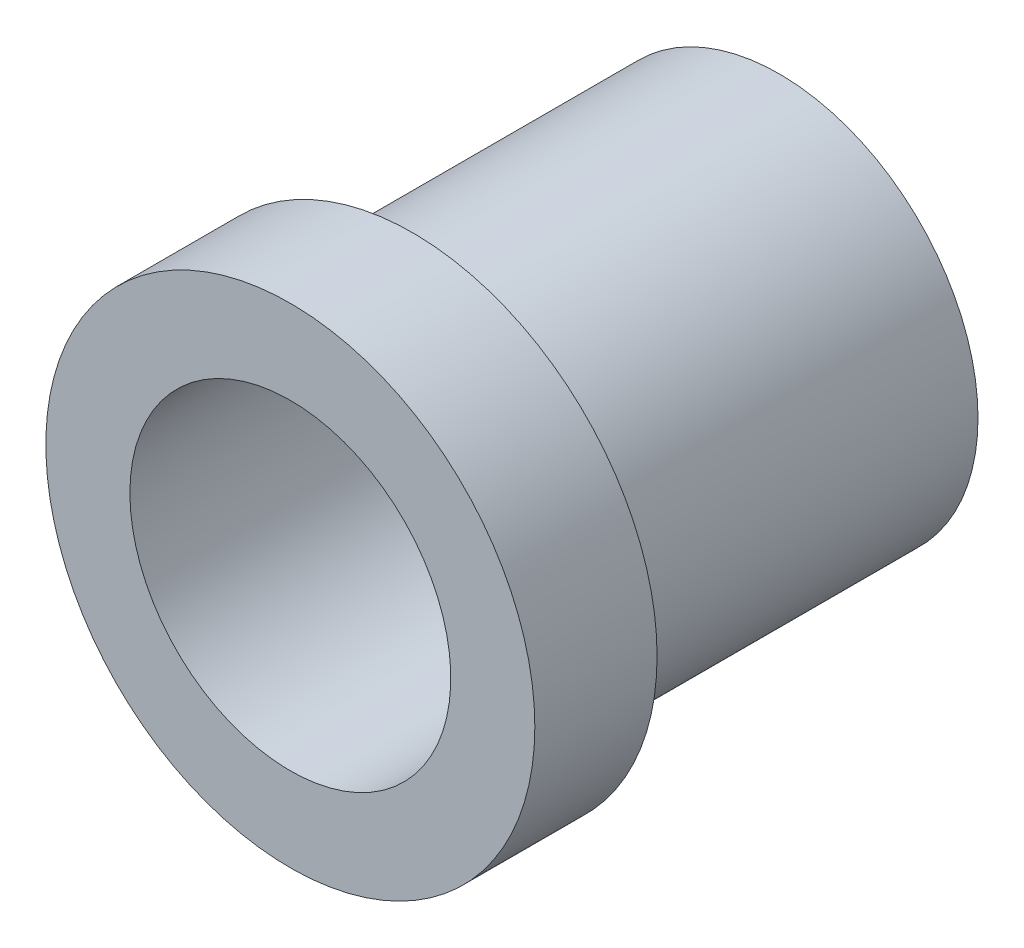
ISO-10303-21;
HEADER;
FILE_DESCRIPTION(('STEP AP214'),'2;1');
FILE_NAME('part.step','',(''),(''),'','','');
FILE_SCHEMA(('AUTOMOTIVE_DESIGN { 1 0 10303 214 1 1 1 1 }'));
ENDSEC;
DATA;
#1=APPLICATION_CONTEXT('core data for automotive mechanical design processes');
#2=APPLICATION_PROTOCOL_DEFINITION('international standard','automotive_design',2000,#1);
#3=PRODUCT_CONTEXT('',#1,'mechanical');
#4=PRODUCT('Part','Part','',(#3));
#5=PRODUCT_RELATED_PRODUCT_CATEGORY('part','',(#4));
#6=PRODUCT_DEFINITION_FORMATION('','',#4);
#7=PRODUCT_DEFINITION_CONTEXT('part definition',#1,'design');
#8=PRODUCT_DEFINITION('design','',#6,#7);
#9=PRODUCT_DEFINITION_SHAPE('','',#8);
#10=(LENGTH_UNIT() NAMED_UNIT(*) SI_UNIT(.MILLI.,.METRE.));
#11=(NAMED_UNIT(*) PLANE_ANGLE_UNIT() SI_UNIT($,.RADIAN.));
#12=(NAMED_UNIT(*) SI_UNIT($,.STERADIAN.) SOLID_ANGLE_UNIT());
#13=UNCERTAINTY_MEASURE_WITH_UNIT(LENGTH_MEASURE(1.E-05),#10,'distance_accuracy_value','');
#14=(GEOMETRIC_REPRESENTATION_CONTEXT(3) GLOBAL_UNCERTAINTY_ASSIGNED_CONTEXT((#13)) GLOBAL_UNIT_ASSIGNED_CONTEXT((#10,
#11,#12)) REPRESENTATION_CONTEXT('',''));
#15=CARTESIAN_POINT('',(0.,0.,0.));
#16=DIRECTION('',(0.,0.,1.));
#17=DIRECTION('',(1.,0.,0.));
#18=AXIS2_PLACEMENT_3D('',#15,#16,#17);
#19=CARTESIAN_POINT('',(0.,0.,12.));
#20=DIRECTION('',(0.,0.,-1.));
#21=DIRECTION('',(-1.,0.,0.));
#22=AXIS2_PLACEMENT_3D('',#19,#20,#21);
#23=CYLINDRICAL_SURFACE('',#22,6.5);
#24=CARTESIAN_POINT('',(0.,0.,12.));
#25=DIRECTION('',(0.,0.,1.));
#26=DIRECTION('',(1.,0.,0.));
#27=AXIS2_PLACEMENT_3D('',#24,#25,#26);
#28=CIRCLE('',#27,6.5);
#29=CARTESIAN_POINT('',(6.5,0.,12.));
#30=VERTEX_POINT('',#29);
#31=EDGE_CURVE('E10',#30,#30,#28,.T.);
#32=ORIENTED_EDGE('',*,*,#31,.F.);
#33=EDGE_LOOP('',(#32));
#34=FACE_BOUND('',#33,.T.);
#35=CARTESIAN_POINT('',(0.,0.,0.));
#36=DIRECTION('',(0.,0.,1.));
#37=DIRECTION('',(1.,0.,0.));
#38=AXIS2_PLACEMENT_3D('',#35,#36,#37);
#39=CIRCLE('',#38,6.5);
#40=CARTESIAN_POINT('',(6.5,0.,0.));
#41=VERTEX_POINT('',#40);
#42=EDGE_CURVE('E40',#41,#41,#39,.T.);
#43=ORIENTED_EDGE('',*,*,#42,.T.);
#44=EDGE_LOOP('',(#43));
#45=FACE_BOUND('',#44,.T.);
#46=ADVANCED_FACE('F37',(#34,#45),#23,.T.);
#47=CARTESIAN_POINT('',(0.,0.,0.));
#48=DIRECTION('',(0.,0.,1.));
#49=DIRECTION('',(1.,0.,0.));
#50=AXIS2_PLACEMENT_3D('',#47,#48,#49);
#51=PLANE('',#50);
#52=CARTESIAN_POINT('',(0.,0.,0.));
#53=DIRECTION('',(0.,0.,1.));
#54=DIRECTION('',(1.,0.,0.));
#55=AXIS2_PLACEMENT_3D('',#52,#53,#54);
#56=CIRCLE('',#55,5.25);
#57=CARTESIAN_POINT('',(5.25,0.,0.));
#58=VERTEX_POINT('',#57);
#59=EDGE_CURVE('E49',#58,#58,#56,.T.);
#60=ORIENTED_EDGE('',*,*,#59,.T.);
#61=EDGE_LOOP('',(#60));
#62=FACE_BOUND('',#61,.T.);
#63=ORIENTED_EDGE('',*,*,#42,.F.);
#64=EDGE_LOOP('',(#63));
#65=FACE_BOUND('',#64,.T.);
#66=ADVANCED_FACE('F73',(#62,#65),#51,.F.);
#67=CARTESIAN_POINT('',(0.,0.,14.));
#68=DIRECTION('',(0.,0.,-1.));
#69=DIRECTION('',(-1.,0.,0.));
#70=AXIS2_PLACEMENT_3D('',#67,#68,#69);
#71=CYLINDRICAL_SURFACE('',#70,5.25);
#72=ORIENTED_EDGE('',*,*,#59,.F.);
#73=EDGE_LOOP('',(#72));
#74=FACE_BOUND('',#73,.T.);
#75=CARTESIAN_POINT('',(0.,0.,16.));
#76=DIRECTION('',(0.,0.,-1.));
#77=DIRECTION('',(-1.,0.,0.));
#78=AXIS2_PLACEMENT_3D('',#75,#76,#77);
#79=CIRCLE('',#78,5.25);
#80=CARTESIAN_POINT('',(-5.25,0.,16.));
#81=VERTEX_POINT('',#80);
#82=EDGE_CURVE('E59',#81,#81,#79,.T.);
#83=ORIENTED_EDGE('',*,*,#82,.F.);
#84=EDGE_LOOP('',(#83));
#85=FACE_BOUND('',#84,.T.);
#86=ADVANCED_FACE('F70',(#74,#85),#71,.F.);
#87=CARTESIAN_POINT('',(0.,0.,12.));
#88=DIRECTION('',(0.,0.,1.));
#89=DIRECTION('',(1.,0.,0.));
#90=AXIS2_PLACEMENT_3D('',#87,#88,#89);
#91=PLANE('',#90);
#92=ORIENTED_EDGE('',*,*,#31,.T.);
#93=EDGE_LOOP('',(#92));
#94=FACE_BOUND('',#93,.T.);
#95=CARTESIAN_POINT('',(0.,0.,12.));
#96=DIRECTION('',(0.,0.,1.));
#97=DIRECTION('',(1.,0.,0.));
#98=AXIS2_PLACEMENT_3D('',#95,#96,#97);
#99=CIRCLE('',#98,8.);
#100=CARTESIAN_POINT('',(8.,0.,12.));
#101=VERTEX_POINT('',#100);
#102=EDGE_CURVE('E55',#101,#101,#99,.T.);
#103=ORIENTED_EDGE('',*,*,#102,.F.);
#104=EDGE_LOOP('',(#103));
#105=FACE_BOUND('',#104,.T.);
#106=ADVANCED_FACE('F72',(#94,#105),#91,.F.);
#107=CARTESIAN_POINT('',(0.,0.,16.));
#108=DIRECTION('',(0.,0.,1.));
#109=DIRECTION('',(1.,0.,0.));
#110=AXIS2_PLACEMENT_3D('',#107,#108,#109);
#111=PLANE('',#110);
#112=ORIENTED_EDGE('',*,*,#82,.T.);
#113=EDGE_LOOP('',(#112));
#114=FACE_BOUND('',#113,.T.);
#115=CARTESIAN_POINT('',(0.,0.,16.));
#116=DIRECTION('',(0.,0.,1.));
#117=DIRECTION('',(1.,0.,0.));
#118=AXIS2_PLACEMENT_3D('',#115,#116,#117);
#119=CIRCLE('',#118,8.);
#120=CARTESIAN_POINT('',(8.,0.,16.));
#121=VERTEX_POINT('',#120);
#122=EDGE_CURVE('E54',#121,#121,#119,.T.);
#123=ORIENTED_EDGE('',*,*,#122,.T.);
#124=EDGE_LOOP('',(#123));
#125=FACE_BOUND('',#124,.T.);
#126=ADVANCED_FACE('F67',(#114,#125),#111,.T.);
#127=CARTESIAN_POINT('',(0.,0.,16.));
#128=DIRECTION('',(0.,0.,-1.));
#129=DIRECTION('',(-1.,0.,0.));
#130=AXIS2_PLACEMENT_3D('',#127,#128,#129);
#131=CYLINDRICAL_SURFACE('',#130,8.);
#132=ORIENTED_EDGE('',*,*,#122,.F.);
#133=EDGE_LOOP('',(#132));
#134=FACE_BOUND('',#133,.T.);
#135=ORIENTED_EDGE('',*,*,#102,.T.);
#136=EDGE_LOOP('',(#135));
#137=FACE_BOUND('',#136,.T.);
#138=ADVANCED_FACE('F109',(#134,#137),#131,.T.);
#139=CLOSED_SHELL('',(#46,#66,#86,#106,#126,#138));
#140=MANIFOLD_SOLID_BREP('B2',#139);
#141=ADVANCED_BREP_SHAPE_REPRESENTATION('',(#18,#140),#14);
#142=SHAPE_DEFINITION_REPRESENTATION(#9,#141);
ENDSEC;
END-ISO-10303-21;
